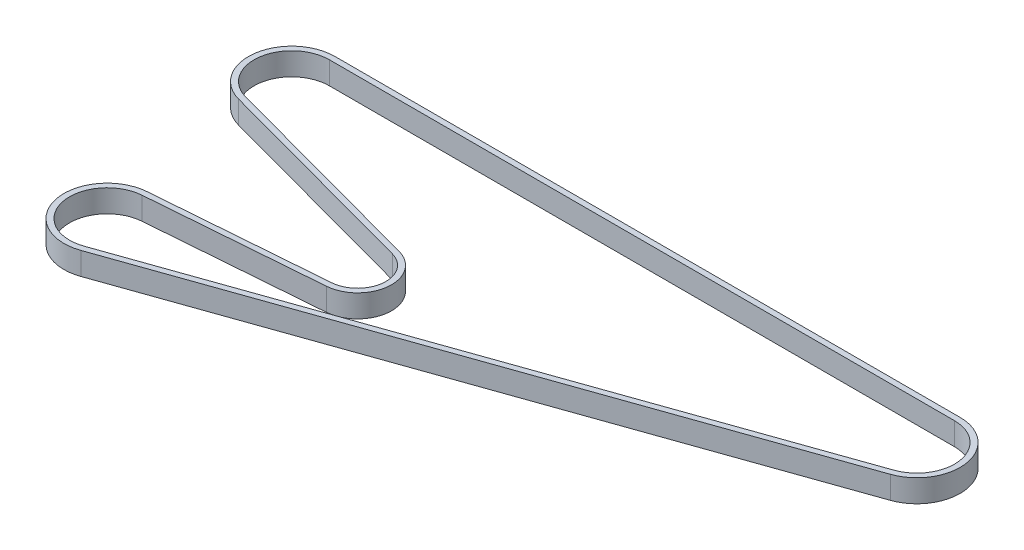
ISO-10303-21;
HEADER;
FILE_DESCRIPTION(('STEP AP214'),'2;1');
FILE_NAME('part.step','',(''),(''),'','','');
FILE_SCHEMA(('AUTOMOTIVE_DESIGN { 1 0 10303 214 1 1 1 1 }'));
ENDSEC;
DATA;
#1=APPLICATION_CONTEXT('core data for automotive mechanical design processes');
#2=APPLICATION_PROTOCOL_DEFINITION('international standard','automotive_design',2000,#1);
#3=PRODUCT_CONTEXT('',#1,'mechanical');
#4=PRODUCT('Part','Part','',(#3));
#5=PRODUCT_RELATED_PRODUCT_CATEGORY('part','',(#4));
#6=PRODUCT_DEFINITION_FORMATION('','',#4);
#7=PRODUCT_DEFINITION_CONTEXT('part definition',#1,'design');
#8=PRODUCT_DEFINITION('design','',#6,#7);
#9=PRODUCT_DEFINITION_SHAPE('','',#8);
#10=(LENGTH_UNIT() NAMED_UNIT(*) SI_UNIT(.MILLI.,.METRE.));
#11=(NAMED_UNIT(*) PLANE_ANGLE_UNIT() SI_UNIT($,.RADIAN.));
#12=(NAMED_UNIT(*) SI_UNIT($,.STERADIAN.) SOLID_ANGLE_UNIT());
#13=UNCERTAINTY_MEASURE_WITH_UNIT(LENGTH_MEASURE(1.E-05),#10,'distance_accuracy_value','');
#14=(GEOMETRIC_REPRESENTATION_CONTEXT(3) GLOBAL_UNCERTAINTY_ASSIGNED_CONTEXT((#13)) GLOBAL_UNIT_ASSIGNED_CONTEXT((#10,
#11,#12)) REPRESENTATION_CONTEXT('',''));
#15=CARTESIAN_POINT('',(0.,0.,0.));
#16=DIRECTION('',(0.,0.,1.));
#17=DIRECTION('',(1.,0.,0.));
#18=AXIS2_PLACEMENT_3D('',#15,#16,#17);
#19=CARTESIAN_POINT('',(-102.,12.,-67.));
#20=DIRECTION('',(0.,1.,0.));
#21=DIRECTION('',(0.,0.,1.));
#22=AXIS2_PLACEMENT_3D('',#19,#20,#21);
#23=PLANE('',#22);
#24=CARTESIAN_POINT('',(-102.,12.,-67.));
#25=DIRECTION('',(0.,1.,0.));
#26=DIRECTION('',(1.,0.,0.));
#27=AXIS2_PLACEMENT_3D('',#24,#25,#26);
#28=CIRCLE('',#27,23.);
#29=CARTESIAN_POINT('',(-102.,12.,-90.));
#30=VERTEX_POINT('',#29);
#31=CARTESIAN_POINT('',(-108.013664020805,12.,-44.8000935802675));
#32=VERTEX_POINT('',#31);
#33=EDGE_CURVE('E260',#30,#32,#28,.T.);
#34=ORIENTED_EDGE('',*,*,#33,.T.);
#35=DIRECTION('',(0.965213322597064,0.,0.261463653078464));
#36=VECTOR('',#35,1.);
#37=CARTESIAN_POINT('',(-108.013664020805,12.,-44.8000935802675));
#38=LINE('',#37,#36);
#39=CARTESIAN_POINT('',(3.92195479617696,12.,-14.478199838956));
#40=VERTEX_POINT('',#39);
#41=EDGE_CURVE('E263',#32,#40,#38,.T.);
#42=ORIENTED_EDGE('',*,*,#41,.T.);
#43=CARTESIAN_POINT('',(0.,12.,0.));
#44=DIRECTION('',(0.,1.,0.));
#45=DIRECTION('',(1.,0.,0.));
#46=AXIS2_PLACEMENT_3D('',#43,#44,#45);
#47=CIRCLE('',#46,15.);
#48=CARTESIAN_POINT('',(1.16981990165518,12.,14.9543144743479));
#49=VERTEX_POINT('',#48);
#50=EDGE_CURVE('E266',#40,#49,#47,.F.);
#51=ORIENTED_EDGE('',*,*,#50,.T.);
#52=DIRECTION('',(-0.996954298289861,0.,0.0779879934436787));
#53=VECTOR('',#52,1.);
#54=CARTESIAN_POINT('',(1.16981990165518,12.,14.9543144743479));
#55=LINE('',#54,#53);
#56=CARTESIAN_POINT('',(-89.7937238492046,12.,22.0700511393332));
#57=VERTEX_POINT('',#56);
#58=EDGE_CURVE('E268',#49,#57,#55,.T.);
#59=ORIENTED_EDGE('',*,*,#58,.T.);
#60=CARTESIAN_POINT('',(-88.,12.,45.));
#61=DIRECTION('',(0.,1.,0.));
#62=DIRECTION('',(1.,0.,0.));
#63=AXIS2_PLACEMENT_3D('',#60,#61,#62);
#64=CIRCLE('',#63,23.);
#65=CARTESIAN_POINT('',(-80.3594125746521,12.,66.6938107255414));
#66=VERTEX_POINT('',#65);
#67=EDGE_CURVE('E270',#57,#66,#64,.T.);
#68=ORIENTED_EDGE('',*,*,#67,.T.);
#69=DIRECTION('',(0.943209161980061,0.,-0.332199453275996));
#70=VECTOR('',#69,1.);
#71=CARTESIAN_POINT('',(-80.3594125746521,12.,66.6938107255414));
#72=LINE('',#71,#70);
#73=CARTESIAN_POINT('',(237.640587425348,12.,-45.3061892744586));
#74=VERTEX_POINT('',#73);
#75=EDGE_CURVE('E272',#66,#74,#72,.T.);
#76=ORIENTED_EDGE('',*,*,#75,.T.);
#77=CARTESIAN_POINT('',(230.,12.,-67.));
#78=DIRECTION('',(0.,1.,0.));
#79=DIRECTION('',(1.,0.,0.));
#80=AXIS2_PLACEMENT_3D('',#77,#78,#79);
#81=CIRCLE('',#80,23.);
#82=CARTESIAN_POINT('',(230.,12.,-90.));
#83=VERTEX_POINT('',#82);
#84=EDGE_CURVE('E274',#74,#83,#81,.T.);
#85=ORIENTED_EDGE('',*,*,#84,.T.);
#86=DIRECTION('',(-1.,0.,0.));
#87=VECTOR('',#86,1.);
#88=CARTESIAN_POINT('',(-102.,12.,-90.));
#89=LINE('',#88,#87);
#90=EDGE_CURVE('E276',#83,#30,#89,.T.);
#91=ORIENTED_EDGE('',*,*,#90,.T.);
#92=EDGE_LOOP('',(#34,#42,#51,#59,#68,#76,#85,#91));
#93=FACE_BOUND('',#92,.T.);
#94=DIRECTION('',(0.965213322597064,0.,0.261463653078464));
#95=VECTOR('',#94,1.);
#96=CARTESIAN_POINT('',(-107.229273061569,12.,-47.6957335480587));
#97=LINE('',#96,#95);
#98=CARTESIAN_POINT('',(-107.229273061569,12.,-47.6957335480587));
#99=VERTEX_POINT('',#98);
#100=CARTESIAN_POINT('',(4.70634575541235,12.,-17.3738398067472));
#101=VERTEX_POINT('',#100);
#102=EDGE_CURVE('E203',#99,#101,#97,.T.);
#103=ORIENTED_EDGE('',*,*,#102,.F.);
#104=CARTESIAN_POINT('',(-102.,12.,-67.));
#105=DIRECTION('',(0.,1.,0.));
#106=DIRECTION('',(0.,0.,1.));
#107=AXIS2_PLACEMENT_3D('',#104,#105,#106);
#108=CIRCLE('',#107,20.);
#109=CARTESIAN_POINT('',(-102.,12.,-87.));
#110=VERTEX_POINT('',#109);
#111=EDGE_CURVE('E195',#110,#99,#108,.T.);
#112=ORIENTED_EDGE('',*,*,#111,.F.);
#113=DIRECTION('',(-1.,0.,0.));
#114=VECTOR('',#113,1.);
#115=CARTESIAN_POINT('',(-102.,12.,-87.));
#116=LINE('',#115,#114);
#117=CARTESIAN_POINT('',(230.,12.,-87.));
#118=VERTEX_POINT('',#117);
#119=EDGE_CURVE('E228',#118,#110,#116,.T.);
#120=ORIENTED_EDGE('',*,*,#119,.F.);
#121=CARTESIAN_POINT('',(230.,12.,-67.));
#122=DIRECTION('',(0.,1.,0.));
#123=DIRECTION('',(0.,0.,1.));
#124=AXIS2_PLACEMENT_3D('',#121,#122,#123);
#125=CIRCLE('',#124,20.);
#126=CARTESIAN_POINT('',(236.64398906552,12.,-48.1358167603988));
#127=VERTEX_POINT('',#126);
#128=EDGE_CURVE('E226',#127,#118,#125,.T.);
#129=ORIENTED_EDGE('',*,*,#128,.F.);
#130=DIRECTION('',(0.943209161980061,0.,-0.332199453275996));
#131=VECTOR('',#130,1.);
#132=CARTESIAN_POINT('',(-81.3560109344801,12.,63.8641832396012));
#133=LINE('',#132,#131);
#134=CARTESIAN_POINT('',(-81.3560109344801,12.,63.8641832396012));
#135=VERTEX_POINT('',#134);
#136=EDGE_CURVE('E224',#135,#127,#133,.T.);
#137=ORIENTED_EDGE('',*,*,#136,.F.);
#138=CARTESIAN_POINT('',(-88.,12.,45.));
#139=DIRECTION('',(0.,1.,0.));
#140=DIRECTION('',(0.,0.,1.));
#141=AXIS2_PLACEMENT_3D('',#138,#139,#140);
#142=CIRCLE('',#141,20.);
#143=CARTESIAN_POINT('',(-89.5597598688736,12.,25.0609140342028));
#144=VERTEX_POINT('',#143);
#145=EDGE_CURVE('E222',#144,#135,#142,.T.);
#146=ORIENTED_EDGE('',*,*,#145,.F.);
#147=DIRECTION('',(-0.996954298289861,0.,0.0779879934436787));
#148=VECTOR('',#147,1.);
#149=CARTESIAN_POINT('',(1.40378388198622,12.,17.9451773692175));
#150=LINE('',#149,#148);
#151=CARTESIAN_POINT('',(1.40378388198622,12.,17.9451773692175));
#152=VERTEX_POINT('',#151);
#153=EDGE_CURVE('E218',#152,#144,#150,.T.);
#154=ORIENTED_EDGE('',*,*,#153,.F.);
#155=CARTESIAN_POINT('',(0.,12.,0.));
#156=DIRECTION('',(0.,-1.,0.));
#157=DIRECTION('',(0.,0.,1.));
#158=AXIS2_PLACEMENT_3D('',#155,#156,#157);
#159=CIRCLE('',#158,18.);
#160=EDGE_CURVE('E216',#101,#152,#159,.T.);
#161=ORIENTED_EDGE('',*,*,#160,.F.);
#162=EDGE_LOOP('',(#103,#112,#120,#129,#137,#146,#154,#161));
#163=FACE_BOUND('',#162,.T.);
#164=ADVANCED_FACE('F82',(#93,#163),#23,.T.);
#165=CARTESIAN_POINT('',(-102.,0.,-67.));
#166=DIRECTION('',(0.,1.,0.));
#167=DIRECTION('',(0.,0.,1.));
#168=AXIS2_PLACEMENT_3D('',#165,#166,#167);
#169=PLANE('',#168);
#170=CARTESIAN_POINT('',(-102.,0.,-67.));
#171=DIRECTION('',(0.,1.,0.));
#172=DIRECTION('',(1.,0.,0.));
#173=AXIS2_PLACEMENT_3D('',#170,#171,#172);
#174=CIRCLE('',#173,23.);
#175=CARTESIAN_POINT('',(-102.,0.,-90.));
#176=VERTEX_POINT('',#175);
#177=CARTESIAN_POINT('',(-108.013664020805,0.,-44.8000935802675));
#178=VERTEX_POINT('',#177);
#179=EDGE_CURVE('E211',#176,#178,#174,.T.);
#180=ORIENTED_EDGE('',*,*,#179,.F.);
#181=DIRECTION('',(-1.,0.,0.));
#182=VECTOR('',#181,1.);
#183=CARTESIAN_POINT('',(-102.,0.,-90.));
#184=LINE('',#183,#182);
#185=CARTESIAN_POINT('',(230.,0.,-90.));
#186=VERTEX_POINT('',#185);
#187=EDGE_CURVE('E264',#186,#176,#184,.T.);
#188=ORIENTED_EDGE('',*,*,#187,.F.);
#189=CARTESIAN_POINT('',(230.,0.,-67.));
#190=DIRECTION('',(0.,1.,0.));
#191=DIRECTION('',(1.,0.,0.));
#192=AXIS2_PLACEMENT_3D('',#189,#190,#191);
#193=CIRCLE('',#192,23.);
#194=CARTESIAN_POINT('',(237.640587425348,0.,-45.3061892744586));
#195=VERTEX_POINT('',#194);
#196=EDGE_CURVE('E291',#195,#186,#193,.T.);
#197=ORIENTED_EDGE('',*,*,#196,.F.);
#198=DIRECTION('',(0.943209161980061,0.,-0.332199453275996));
#199=VECTOR('',#198,1.);
#200=CARTESIAN_POINT('',(-80.3594125746521,0.,66.6938107255414));
#201=LINE('',#200,#199);
#202=CARTESIAN_POINT('',(-80.3594125746521,0.,66.6938107255414));
#203=VERTEX_POINT('',#202);
#204=EDGE_CURVE('E289',#203,#195,#201,.T.);
#205=ORIENTED_EDGE('',*,*,#204,.F.);
#206=CARTESIAN_POINT('',(-88.,0.,45.));
#207=DIRECTION('',(0.,1.,0.));
#208=DIRECTION('',(1.,0.,0.));
#209=AXIS2_PLACEMENT_3D('',#206,#207,#208);
#210=CIRCLE('',#209,23.);
#211=CARTESIAN_POINT('',(-89.7937238492046,0.,22.0700511393332));
#212=VERTEX_POINT('',#211);
#213=EDGE_CURVE('E287',#212,#203,#210,.T.);
#214=ORIENTED_EDGE('',*,*,#213,.F.);
#215=DIRECTION('',(-0.996954298289861,0.,0.0779879934436787));
#216=VECTOR('',#215,1.);
#217=CARTESIAN_POINT('',(1.16981990165518,0.,14.9543144743479));
#218=LINE('',#217,#216);
#219=CARTESIAN_POINT('',(1.16981990165518,0.,14.9543144743479));
#220=VERTEX_POINT('',#219);
#221=EDGE_CURVE('E285',#220,#212,#218,.T.);
#222=ORIENTED_EDGE('',*,*,#221,.F.);
#223=CARTESIAN_POINT('',(0.,0.,0.));
#224=DIRECTION('',(0.,1.,0.));
#225=DIRECTION('',(1.,0.,0.));
#226=AXIS2_PLACEMENT_3D('',#223,#224,#225);
#227=CIRCLE('',#226,15.);
#228=CARTESIAN_POINT('',(3.92195479617696,0.,-14.478199838956));
#229=VERTEX_POINT('',#228);
#230=EDGE_CURVE('E283',#229,#220,#227,.F.);
#231=ORIENTED_EDGE('',*,*,#230,.F.);
#232=DIRECTION('',(0.965213322597064,0.,0.261463653078464));
#233=VECTOR('',#232,1.);
#234=CARTESIAN_POINT('',(-108.013664020805,0.,-44.8000935802675));
#235=LINE('',#234,#233);
#236=EDGE_CURVE('E281',#178,#229,#235,.T.);
#237=ORIENTED_EDGE('',*,*,#236,.F.);
#238=EDGE_LOOP('',(#180,#188,#197,#205,#214,#222,#231,#237));
#239=FACE_BOUND('',#238,.T.);
#240=CARTESIAN_POINT('',(-102.,0.,-67.));
#241=DIRECTION('',(0.,1.,0.));
#242=DIRECTION('',(0.,0.,1.));
#243=AXIS2_PLACEMENT_3D('',#240,#241,#242);
#244=CIRCLE('',#243,20.);
#245=CARTESIAN_POINT('',(-102.,0.,-87.));
#246=VERTEX_POINT('',#245);
#247=CARTESIAN_POINT('',(-107.229273061569,0.,-47.6957335480587));
#248=VERTEX_POINT('',#247);
#249=EDGE_CURVE('E105',#246,#248,#244,.T.);
#250=ORIENTED_EDGE('',*,*,#249,.T.);
#251=DIRECTION('',(0.965213322597064,0.,0.261463653078464));
#252=VECTOR('',#251,1.);
#253=CARTESIAN_POINT('',(-107.229273061569,0.,-47.6957335480587));
#254=LINE('',#253,#252);
#255=CARTESIAN_POINT('',(4.70634575541235,0.,-17.3738398067472));
#256=VERTEX_POINT('',#255);
#257=EDGE_CURVE('E210',#248,#256,#254,.T.);
#258=ORIENTED_EDGE('',*,*,#257,.T.);
#259=CARTESIAN_POINT('',(0.,0.,0.));
#260=DIRECTION('',(0.,-1.,0.));
#261=DIRECTION('',(0.,0.,1.));
#262=AXIS2_PLACEMENT_3D('',#259,#260,#261);
#263=CIRCLE('',#262,18.);
#264=CARTESIAN_POINT('',(1.40378388198622,0.,17.9451773692175));
#265=VERTEX_POINT('',#264);
#266=EDGE_CURVE('E232',#256,#265,#263,.T.);
#267=ORIENTED_EDGE('',*,*,#266,.T.);
#268=DIRECTION('',(-0.996954298289861,0.,0.0779879934436787));
#269=VECTOR('',#268,1.);
#270=CARTESIAN_POINT('',(1.40378388198622,0.,17.9451773692175));
#271=LINE('',#270,#269);
#272=CARTESIAN_POINT('',(-89.5597598688736,0.,25.0609140342028));
#273=VERTEX_POINT('',#272);
#274=EDGE_CURVE('E235',#265,#273,#271,.T.);
#275=ORIENTED_EDGE('',*,*,#274,.T.);
#276=CARTESIAN_POINT('',(-88.,0.,45.));
#277=DIRECTION('',(0.,1.,0.));
#278=DIRECTION('',(0.,0.,1.));
#279=AXIS2_PLACEMENT_3D('',#276,#277,#278);
#280=CIRCLE('',#279,20.);
#281=CARTESIAN_POINT('',(-81.3560109344801,0.,63.8641832396012));
#282=VERTEX_POINT('',#281);
#283=EDGE_CURVE('E238',#273,#282,#280,.T.);
#284=ORIENTED_EDGE('',*,*,#283,.T.);
#285=DIRECTION('',(0.943209161980061,0.,-0.332199453275996));
#286=VECTOR('',#285,1.);
#287=CARTESIAN_POINT('',(-81.3560109344801,0.,63.8641832396012));
#288=LINE('',#287,#286);
#289=CARTESIAN_POINT('',(236.64398906552,0.,-48.1358167603988));
#290=VERTEX_POINT('',#289);
#291=EDGE_CURVE('E241',#282,#290,#288,.T.);
#292=ORIENTED_EDGE('',*,*,#291,.T.);
#293=CARTESIAN_POINT('',(230.,0.,-67.));
#294=DIRECTION('',(0.,1.,0.));
#295=DIRECTION('',(0.,0.,1.));
#296=AXIS2_PLACEMENT_3D('',#293,#294,#295);
#297=CIRCLE('',#296,20.);
#298=CARTESIAN_POINT('',(230.,0.,-87.));
#299=VERTEX_POINT('',#298);
#300=EDGE_CURVE('E244',#290,#299,#297,.T.);
#301=ORIENTED_EDGE('',*,*,#300,.T.);
#302=DIRECTION('',(-1.,0.,0.));
#303=VECTOR('',#302,1.);
#304=CARTESIAN_POINT('',(-102.,0.,-87.));
#305=LINE('',#304,#303);
#306=EDGE_CURVE('E204',#299,#246,#305,.T.);
#307=ORIENTED_EDGE('',*,*,#306,.T.);
#308=EDGE_LOOP('',(#250,#258,#267,#275,#284,#292,#301,#307));
#309=FACE_BOUND('',#308,.T.);
#310=ADVANCED_FACE('F321',(#239,#309),#169,.F.);
#311=CARTESIAN_POINT('',(-102.,12.,-67.));
#312=DIRECTION('',(0.,-1.,0.));
#313=DIRECTION('',(0.,0.,-1.));
#314=AXIS2_PLACEMENT_3D('',#311,#312,#313);
#315=CYLINDRICAL_SURFACE('',#314,23.);
#316=ORIENTED_EDGE('',*,*,#179,.T.);
#317=DIRECTION('',(0.,-1.,0.));
#318=VECTOR('',#317,1.);
#319=CARTESIAN_POINT('',(-108.013664020805,12.,-44.8000935802675));
#320=LINE('',#319,#318);
#321=EDGE_CURVE('E12',#32,#178,#320,.T.);
#322=ORIENTED_EDGE('',*,*,#321,.F.);
#323=ORIENTED_EDGE('',*,*,#33,.F.);
#324=DIRECTION('',(0.,-1.,0.));
#325=VECTOR('',#324,1.);
#326=CARTESIAN_POINT('',(-102.,12.,-90.));
#327=LINE('',#326,#325);
#328=EDGE_CURVE('E278',#30,#176,#327,.T.);
#329=ORIENTED_EDGE('',*,*,#328,.T.);
#330=EDGE_LOOP('',(#316,#322,#323,#329));
#331=FACE_BOUND('',#330,.T.);
#332=ADVANCED_FACE('F84',(#331),#315,.T.);
#333=CARTESIAN_POINT('',(-108.013664020805,12.,-44.8000935802675));
#334=DIRECTION('',(0.261463653078464,0.,-0.965213322597064));
#335=DIRECTION('',(-0.965213322597064,0.,-0.261463653078464));
#336=AXIS2_PLACEMENT_3D('',#333,#334,#335);
#337=PLANE('',#336);
#338=ORIENTED_EDGE('',*,*,#236,.T.);
#339=DIRECTION('',(0.,-1.,0.));
#340=VECTOR('',#339,1.);
#341=CARTESIAN_POINT('',(3.92195479617696,12.,-14.478199838956));
#342=LINE('',#341,#340);
#343=EDGE_CURVE('E90',#40,#229,#342,.T.);
#344=ORIENTED_EDGE('',*,*,#343,.F.);
#345=ORIENTED_EDGE('',*,*,#41,.F.);
#346=ORIENTED_EDGE('',*,*,#321,.T.);
#347=EDGE_LOOP('',(#338,#344,#345,#346));
#348=FACE_BOUND('',#347,.T.);
#349=ADVANCED_FACE('F338',(#348),#337,.F.);
#350=CARTESIAN_POINT('',(0.,12.,0.));
#351=DIRECTION('',(0.,-1.,0.));
#352=DIRECTION('',(0.,0.,-1.));
#353=AXIS2_PLACEMENT_3D('',#350,#351,#352);
#354=CYLINDRICAL_SURFACE('',#353,15.);
#355=ORIENTED_EDGE('',*,*,#230,.T.);
#356=DIRECTION('',(0.,-1.,0.));
#357=VECTOR('',#356,1.);
#358=CARTESIAN_POINT('',(1.16981990165518,12.,14.9543144743479));
#359=LINE('',#358,#357);
#360=EDGE_CURVE('E308',#49,#220,#359,.T.);
#361=ORIENTED_EDGE('',*,*,#360,.F.);
#362=ORIENTED_EDGE('',*,*,#50,.F.);
#363=ORIENTED_EDGE('',*,*,#343,.T.);
#364=EDGE_LOOP('',(#355,#361,#362,#363));
#365=FACE_BOUND('',#364,.T.);
#366=ADVANCED_FACE('F315',(#365),#354,.F.);
#367=CARTESIAN_POINT('',(1.16981990165518,12.,14.9543144743479));
#368=DIRECTION('',(0.0779879934436787,0.,0.996954298289861));
#369=DIRECTION('',(0.996954298289861,0.,-0.0779879934436787));
#370=AXIS2_PLACEMENT_3D('',#367,#368,#369);
#371=PLANE('',#370);
#372=ORIENTED_EDGE('',*,*,#221,.T.);
#373=DIRECTION('',(0.,-1.,0.));
#374=VECTOR('',#373,1.);
#375=CARTESIAN_POINT('',(-89.7937238492046,12.,22.0700511393332));
#376=LINE('',#375,#374);
#377=EDGE_CURVE('E305',#57,#212,#376,.T.);
#378=ORIENTED_EDGE('',*,*,#377,.F.);
#379=ORIENTED_EDGE('',*,*,#58,.F.);
#380=ORIENTED_EDGE('',*,*,#360,.T.);
#381=EDGE_LOOP('',(#372,#378,#379,#380));
#382=FACE_BOUND('',#381,.T.);
#383=ADVANCED_FACE('F327',(#382),#371,.F.);
#384=CARTESIAN_POINT('',(-88.,12.,45.));
#385=DIRECTION('',(0.,-1.,0.));
#386=DIRECTION('',(0.,0.,-1.));
#387=AXIS2_PLACEMENT_3D('',#384,#385,#386);
#388=CYLINDRICAL_SURFACE('',#387,23.);
#389=ORIENTED_EDGE('',*,*,#213,.T.);
#390=DIRECTION('',(0.,-1.,0.));
#391=VECTOR('',#390,1.);
#392=CARTESIAN_POINT('',(-80.3594125746521,12.,66.6938107255414));
#393=LINE('',#392,#391);
#394=EDGE_CURVE('E302',#66,#203,#393,.T.);
#395=ORIENTED_EDGE('',*,*,#394,.F.);
#396=ORIENTED_EDGE('',*,*,#67,.F.);
#397=ORIENTED_EDGE('',*,*,#377,.T.);
#398=EDGE_LOOP('',(#389,#395,#396,#397));
#399=FACE_BOUND('',#398,.T.);
#400=ADVANCED_FACE('F331',(#399),#388,.T.);
#401=CARTESIAN_POINT('',(-80.3594125746521,12.,66.6938107255414));
#402=DIRECTION('',(-0.332199453275996,0.,-0.943209161980061));
#403=DIRECTION('',(-0.943209161980061,0.,0.332199453275996));
#404=AXIS2_PLACEMENT_3D('',#401,#402,#403);
#405=PLANE('',#404);
#406=ORIENTED_EDGE('',*,*,#204,.T.);
#407=DIRECTION('',(0.,-1.,0.));
#408=VECTOR('',#407,1.);
#409=CARTESIAN_POINT('',(237.640587425348,12.,-45.3061892744586));
#410=LINE('',#409,#408);
#411=EDGE_CURVE('E299',#74,#195,#410,.T.);
#412=ORIENTED_EDGE('',*,*,#411,.F.);
#413=ORIENTED_EDGE('',*,*,#75,.F.);
#414=ORIENTED_EDGE('',*,*,#394,.T.);
#415=EDGE_LOOP('',(#406,#412,#413,#414));
#416=FACE_BOUND('',#415,.T.);
#417=ADVANCED_FACE('F351',(#416),#405,.F.);
#418=CARTESIAN_POINT('',(230.,12.,-67.));
#419=DIRECTION('',(0.,-1.,0.));
#420=DIRECTION('',(0.,0.,-1.));
#421=AXIS2_PLACEMENT_3D('',#418,#419,#420);
#422=CYLINDRICAL_SURFACE('',#421,23.);
#423=ORIENTED_EDGE('',*,*,#196,.T.);
#424=DIRECTION('',(0.,-1.,0.));
#425=VECTOR('',#424,1.);
#426=CARTESIAN_POINT('',(230.,12.,-90.));
#427=LINE('',#426,#425);
#428=EDGE_CURVE('E296',#83,#186,#427,.T.);
#429=ORIENTED_EDGE('',*,*,#428,.F.);
#430=ORIENTED_EDGE('',*,*,#84,.F.);
#431=ORIENTED_EDGE('',*,*,#411,.T.);
#432=EDGE_LOOP('',(#423,#429,#430,#431));
#433=FACE_BOUND('',#432,.T.);
#434=ADVANCED_FACE('F349',(#433),#422,.T.);
#435=CARTESIAN_POINT('',(-102.,12.,-90.));
#436=DIRECTION('',(0.,0.,1.));
#437=DIRECTION('',(1.,0.,0.));
#438=AXIS2_PLACEMENT_3D('',#435,#436,#437);
#439=PLANE('',#438);
#440=ORIENTED_EDGE('',*,*,#187,.T.);
#441=ORIENTED_EDGE('',*,*,#328,.F.);
#442=ORIENTED_EDGE('',*,*,#90,.F.);
#443=ORIENTED_EDGE('',*,*,#428,.T.);
#444=EDGE_LOOP('',(#440,#441,#442,#443));
#445=FACE_BOUND('',#444,.T.);
#446=ADVANCED_FACE('F344',(#445),#439,.F.);
#447=CARTESIAN_POINT('',(-102.,12.,-67.));
#448=DIRECTION('',(0.,-1.,0.));
#449=DIRECTION('',(0.,0.,-1.));
#450=AXIS2_PLACEMENT_3D('',#447,#448,#449);
#451=CYLINDRICAL_SURFACE('',#450,20.);
#452=ORIENTED_EDGE('',*,*,#249,.F.);
#453=DIRECTION('',(0.,-1.,0.));
#454=VECTOR('',#453,1.);
#455=CARTESIAN_POINT('',(-102.,12.,-87.));
#456=LINE('',#455,#454);
#457=EDGE_CURVE('E199',#110,#246,#456,.T.);
#458=ORIENTED_EDGE('',*,*,#457,.F.);
#459=ORIENTED_EDGE('',*,*,#111,.T.);
#460=DIRECTION('',(0.,-1.,0.));
#461=VECTOR('',#460,1.);
#462=CARTESIAN_POINT('',(-107.229273061569,12.,-47.6957335480587));
#463=LINE('',#462,#461);
#464=EDGE_CURVE('E198',#99,#248,#463,.T.);
#465=ORIENTED_EDGE('',*,*,#464,.T.);
#466=EDGE_LOOP('',(#452,#458,#459,#465));
#467=FACE_BOUND('',#466,.T.);
#468=ADVANCED_FACE('F197',(#467),#451,.F.);
#469=CARTESIAN_POINT('',(-107.229273061569,12.,-47.6957335480587));
#470=DIRECTION('',(0.261463653078464,0.,-0.965213322597064));
#471=DIRECTION('',(-0.965213322597064,0.,-0.261463653078464));
#472=AXIS2_PLACEMENT_3D('',#469,#470,#471);
#473=PLANE('',#472);
#474=ORIENTED_EDGE('',*,*,#257,.F.);
#475=ORIENTED_EDGE('',*,*,#464,.F.);
#476=ORIENTED_EDGE('',*,*,#102,.T.);
#477=DIRECTION('',(0.,-1.,0.));
#478=VECTOR('',#477,1.);
#479=CARTESIAN_POINT('',(4.70634575541235,12.,-17.3738398067472));
#480=LINE('',#479,#478);
#481=EDGE_CURVE('E212',#101,#256,#480,.T.);
#482=ORIENTED_EDGE('',*,*,#481,.T.);
#483=EDGE_LOOP('',(#474,#475,#476,#482));
#484=FACE_BOUND('',#483,.T.);
#485=ADVANCED_FACE('F207',(#484),#473,.T.);
#486=CARTESIAN_POINT('',(0.,12.,0.));
#487=DIRECTION('',(0.,-1.,0.));
#488=DIRECTION('',(0.,0.,-1.));
#489=AXIS2_PLACEMENT_3D('',#486,#487,#488);
#490=CYLINDRICAL_SURFACE('',#489,18.);
#491=ORIENTED_EDGE('',*,*,#266,.F.);
#492=ORIENTED_EDGE('',*,*,#481,.F.);
#493=ORIENTED_EDGE('',*,*,#160,.T.);
#494=DIRECTION('',(0.,-1.,0.));
#495=VECTOR('',#494,1.);
#496=CARTESIAN_POINT('',(1.40378388198622,12.,17.9451773692175));
#497=LINE('',#496,#495);
#498=EDGE_CURVE('E257',#152,#265,#497,.T.);
#499=ORIENTED_EDGE('',*,*,#498,.T.);
#500=EDGE_LOOP('',(#491,#492,#493,#499));
#501=FACE_BOUND('',#500,.T.);
#502=ADVANCED_FACE('F376',(#501),#490,.T.);
#503=CARTESIAN_POINT('',(1.40378388198622,12.,17.9451773692175));
#504=DIRECTION('',(0.0779879934436787,0.,0.996954298289861));
#505=DIRECTION('',(0.996954298289861,0.,-0.0779879934436787));
#506=AXIS2_PLACEMENT_3D('',#503,#504,#505);
#507=PLANE('',#506);
#508=ORIENTED_EDGE('',*,*,#274,.F.);
#509=ORIENTED_EDGE('',*,*,#498,.F.);
#510=ORIENTED_EDGE('',*,*,#153,.T.);
#511=DIRECTION('',(0.,-1.,0.));
#512=VECTOR('',#511,1.);
#513=CARTESIAN_POINT('',(-89.5597598688736,12.,25.0609140342028));
#514=LINE('',#513,#512);
#515=EDGE_CURVE('E255',#144,#273,#514,.T.);
#516=ORIENTED_EDGE('',*,*,#515,.T.);
#517=EDGE_LOOP('',(#508,#509,#510,#516));
#518=FACE_BOUND('',#517,.T.);
#519=ADVANCED_FACE('F380',(#518),#507,.T.);
#520=CARTESIAN_POINT('',(-88.,12.,45.));
#521=DIRECTION('',(0.,-1.,0.));
#522=DIRECTION('',(0.,0.,-1.));
#523=AXIS2_PLACEMENT_3D('',#520,#521,#522);
#524=CYLINDRICAL_SURFACE('',#523,20.);
#525=ORIENTED_EDGE('',*,*,#283,.F.);
#526=ORIENTED_EDGE('',*,*,#515,.F.);
#527=ORIENTED_EDGE('',*,*,#145,.T.);
#528=DIRECTION('',(0.,-1.,0.));
#529=VECTOR('',#528,1.);
#530=CARTESIAN_POINT('',(-81.3560109344801,12.,63.8641832396012));
#531=LINE('',#530,#529);
#532=EDGE_CURVE('E253',#135,#282,#531,.T.);
#533=ORIENTED_EDGE('',*,*,#532,.T.);
#534=EDGE_LOOP('',(#525,#526,#527,#533));
#535=FACE_BOUND('',#534,.T.);
#536=ADVANCED_FACE('F386',(#535),#524,.F.);
#537=CARTESIAN_POINT('',(-81.3560109344801,12.,63.8641832396012));
#538=DIRECTION('',(-0.332199453275996,0.,-0.943209161980061));
#539=DIRECTION('',(-0.943209161980061,0.,0.332199453275996));
#540=AXIS2_PLACEMENT_3D('',#537,#538,#539);
#541=PLANE('',#540);
#542=ORIENTED_EDGE('',*,*,#291,.F.);
#543=ORIENTED_EDGE('',*,*,#532,.F.);
#544=ORIENTED_EDGE('',*,*,#136,.T.);
#545=DIRECTION('',(0.,-1.,0.));
#546=VECTOR('',#545,1.);
#547=CARTESIAN_POINT('',(236.64398906552,12.,-48.1358167603988));
#548=LINE('',#547,#546);
#549=EDGE_CURVE('E251',#127,#290,#548,.T.);
#550=ORIENTED_EDGE('',*,*,#549,.T.);
#551=EDGE_LOOP('',(#542,#543,#544,#550));
#552=FACE_BOUND('',#551,.T.);
#553=ADVANCED_FACE('F390',(#552),#541,.T.);
#554=CARTESIAN_POINT('',(230.,12.,-67.));
#555=DIRECTION('',(0.,-1.,0.));
#556=DIRECTION('',(0.,0.,-1.));
#557=AXIS2_PLACEMENT_3D('',#554,#555,#556);
#558=CYLINDRICAL_SURFACE('',#557,20.);
#559=ORIENTED_EDGE('',*,*,#300,.F.);
#560=ORIENTED_EDGE('',*,*,#549,.F.);
#561=ORIENTED_EDGE('',*,*,#128,.T.);
#562=DIRECTION('',(0.,-1.,0.));
#563=VECTOR('',#562,1.);
#564=CARTESIAN_POINT('',(230.,12.,-87.));
#565=LINE('',#564,#563);
#566=EDGE_CURVE('E97',#118,#299,#565,.T.);
#567=ORIENTED_EDGE('',*,*,#566,.T.);
#568=EDGE_LOOP('',(#559,#560,#561,#567));
#569=FACE_BOUND('',#568,.T.);
#570=ADVANCED_FACE('F394',(#569),#558,.F.);
#571=CARTESIAN_POINT('',(-102.,12.,-87.));
#572=DIRECTION('',(0.,0.,1.));
#573=DIRECTION('',(1.,0.,0.));
#574=AXIS2_PLACEMENT_3D('',#571,#572,#573);
#575=PLANE('',#574);
#576=ORIENTED_EDGE('',*,*,#306,.F.);
#577=ORIENTED_EDGE('',*,*,#566,.F.);
#578=ORIENTED_EDGE('',*,*,#119,.T.);
#579=ORIENTED_EDGE('',*,*,#457,.T.);
#580=EDGE_LOOP('',(#576,#577,#578,#579));
#581=FACE_BOUND('',#580,.T.);
#582=ADVANCED_FACE('F398',(#581),#575,.T.);
#583=CLOSED_SHELL('',(#164,#310,#332,#349,#366,#383,#400,#417,#434,#446,#468,#485,#502,#519,
#536,#553,#570,#582));
#584=MANIFOLD_SOLID_BREP('B2',#583);
#585=ADVANCED_BREP_SHAPE_REPRESENTATION('',(#18,#584),#14);
#586=SHAPE_DEFINITION_REPRESENTATION(#9,#585);
ENDSEC;
END-ISO-10303-21;
